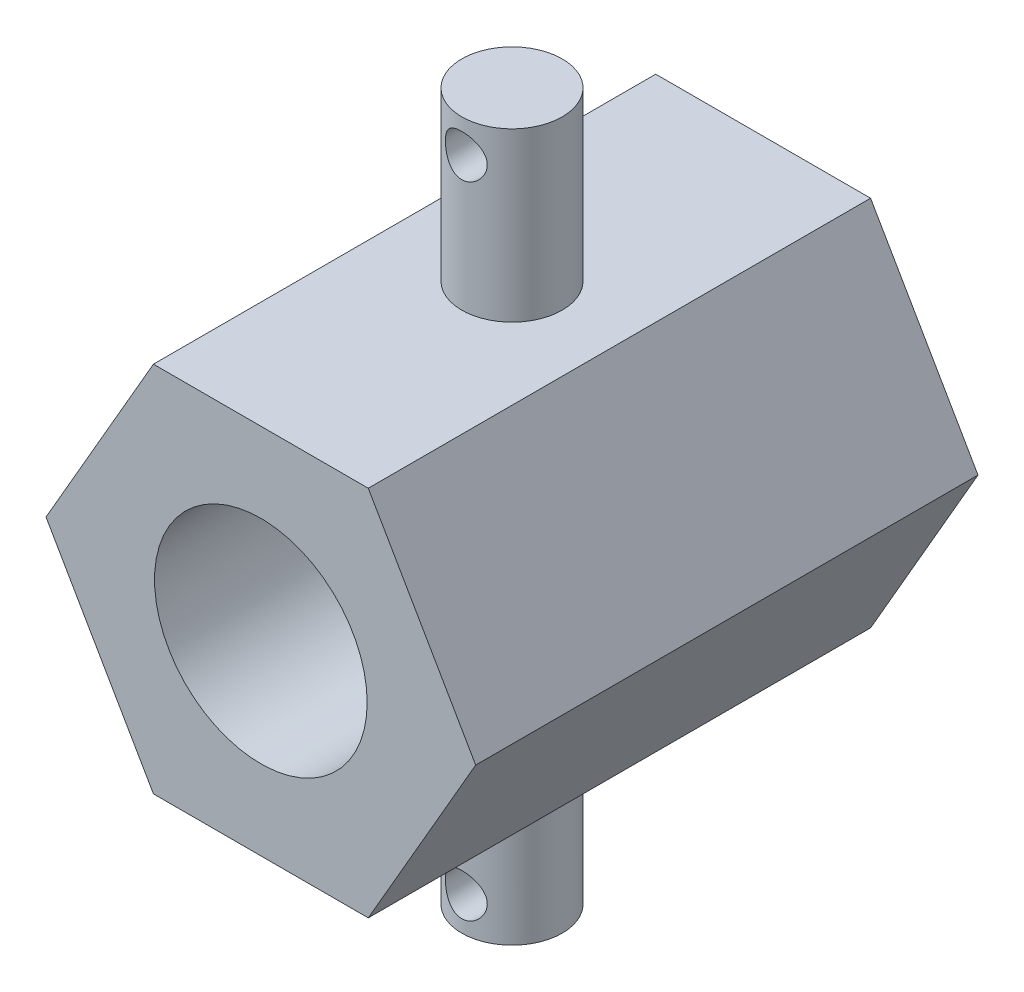
ISO-10303-21;
HEADER;
FILE_DESCRIPTION(('STEP AP214'),'2;1');
FILE_NAME('part.step','',(''),(''),'','','');
FILE_SCHEMA(('AUTOMOTIVE_DESIGN { 1 0 10303 214 1 1 1 1 }'));
ENDSEC;
DATA;
#1=APPLICATION_CONTEXT('core data for automotive mechanical design processes');
#2=APPLICATION_PROTOCOL_DEFINITION('international standard','automotive_design',2000,#1);
#3=PRODUCT_CONTEXT('',#1,'mechanical');
#4=PRODUCT('Part','Part','',(#3));
#5=PRODUCT_RELATED_PRODUCT_CATEGORY('part','',(#4));
#6=PRODUCT_DEFINITION_FORMATION('','',#4);
#7=PRODUCT_DEFINITION_CONTEXT('part definition',#1,'design');
#8=PRODUCT_DEFINITION('design','',#6,#7);
#9=PRODUCT_DEFINITION_SHAPE('','',#8);
#10=(LENGTH_UNIT() NAMED_UNIT(*) SI_UNIT(.MILLI.,.METRE.));
#11=(NAMED_UNIT(*) PLANE_ANGLE_UNIT() SI_UNIT($,.RADIAN.));
#12=(NAMED_UNIT(*) SI_UNIT($,.STERADIAN.) SOLID_ANGLE_UNIT());
#13=UNCERTAINTY_MEASURE_WITH_UNIT(LENGTH_MEASURE(1.E-05),#10,'distance_accuracy_value','');
#14=(GEOMETRIC_REPRESENTATION_CONTEXT(3) GLOBAL_UNCERTAINTY_ASSIGNED_CONTEXT((#13)) GLOBAL_UNIT_ASSIGNED_CONTEXT((#10,
#11,#12)) REPRESENTATION_CONTEXT('',''));
#15=CARTESIAN_POINT('',(0.,0.,0.));
#16=DIRECTION('',(0.,0.,1.));
#17=DIRECTION('',(1.,0.,0.));
#18=AXIS2_PLACEMENT_3D('',#15,#16,#17);
#19=CARTESIAN_POINT('',(0.,-21.1125,15.));
#20=DIRECTION('',(0.,1.,0.));
#21=DIRECTION('',(-1.,0.,0.));
#22=AXIS2_PLACEMENT_3D('',#19,#20,#21);
#23=CYLINDRICAL_SURFACE('',#22,3.);
#24=CARTESIAN_POINT('',(0.,-21.1125,15.));
#25=DIRECTION('',(0.,-1.,0.));
#26=DIRECTION('',(1.,0.,0.));
#27=AXIS2_PLACEMENT_3D('',#24,#25,#26);
#28=CIRCLE('',#27,3.);
#29=CARTESIAN_POINT('',(2.99999999999999,-21.1125,15.));
#30=VERTEX_POINT('',#29);
#31=EDGE_CURVE('E186',#30,#30,#28,.T.);
#32=ORIENTED_EDGE('',*,*,#31,.F.);
#33=EDGE_LOOP('',(#32));
#34=FACE_BOUND('',#33,.T.);
#35=CARTESIAN_POINT('',(0.,-11.1125,15.));
#36=DIRECTION('',(0.,1.,0.));
#37=DIRECTION('',(-1.,0.,0.));
#38=AXIS2_PLACEMENT_3D('',#35,#36,#37);
#39=CIRCLE('',#38,3.);
#40=CARTESIAN_POINT('',(-3.,-11.1125,15.));
#41=VERTEX_POINT('',#40);
#42=EDGE_CURVE('E11',#41,#41,#39,.F.);
#43=ORIENTED_EDGE('',*,*,#42,.T.);
#44=EDGE_LOOP('',(#43));
#45=FACE_BOUND('',#44,.T.);
#46=CARTESIAN_POINT('',(-1.25,-19.1125,12.2728219713411));
#47=CARTESIAN_POINT('',(-1.24999259066568,-19.0458281091031,12.2728148043678));
#48=CARTESIAN_POINT('',(-1.24463203881503,-18.9790473431738,12.270341404656));
#49=CARTESIAN_POINT('',(-1.22339678947785,-18.8474130579429,12.2607616634912));
#50=CARTESIAN_POINT('',(-1.20749354003277,-18.7825652733248,12.2536427417573));
#51=CARTESIAN_POINT('',(-1.16589988419451,-18.6569388703089,12.2357308242523));
#52=CARTESIAN_POINT('',(-1.14024937431428,-18.596144836285,12.2249528243738));
#53=CARTESIAN_POINT('',(-1.08000637754463,-18.4797405504219,12.2009585143421));
#54=CARTESIAN_POINT('',(-1.04541600591531,-18.4241290765669,12.1877427811922));
#55=CARTESIAN_POINT('',(-0.965973882676167,-18.3161742750265,12.1594423738014));
#56=CARTESIAN_POINT('',(-0.920653238184409,-18.2641924412559,12.1442943192085));
#57=CARTESIAN_POINT('',(-0.822021675745551,-18.1682997775024,12.1143570462777));
#58=CARTESIAN_POINT('',(-0.768707691374005,-18.124392059387,12.0995679681921));
#59=CARTESIAN_POINT('',(-0.652763393797348,-18.0440504691207,12.0712446206939));
#60=CARTESIAN_POINT('',(-0.589829293683659,-18.0080233719676,12.0577926002471));
#61=CARTESIAN_POINT('',(-0.458132022362353,-17.9472239794944,12.0344348000657));
#62=CARTESIAN_POINT('',(-0.389371454872123,-17.9224466880358,12.0245274465284));
#63=CARTESIAN_POINT('',(-0.251768498025164,-17.8861605412433,12.0098247895763));
#64=CARTESIAN_POINT('',(-0.183116576196079,-17.874028305098,12.0047902887253));
#65=CARTESIAN_POINT('',(-0.0445791803650048,-17.8613623588401,11.999531713888));
#66=CARTESIAN_POINT('',(0.0253057817645178,-17.860823944117,11.9993056886898));
#67=CARTESIAN_POINT('',(0.159792780112569,-17.8710342809333,12.0035487086694));
#68=CARTESIAN_POINT('',(0.224457488607315,-17.8810981005257,12.0077328535134));
#69=CARTESIAN_POINT('',(0.351082893931458,-17.9110531026382,12.0199348324969));
#70=CARTESIAN_POINT('',(0.413043391054918,-17.9309450096302,12.0279529492542));
#71=CARTESIAN_POINT('',(0.533638118077528,-17.9802280408946,12.0472014758597));
#72=CARTESIAN_POINT('',(0.592207177074908,-18.0097594628708,12.0584790287392));
#73=CARTESIAN_POINT('',(0.703711767281965,-18.0773457567003,12.0831428601019));
#74=CARTESIAN_POINT('',(0.756645297756976,-18.115403640845,12.0965298833374));
#75=CARTESIAN_POINT('',(0.859340911707926,-18.2020824204046,12.1251830122294));
#76=CARTESIAN_POINT('',(0.908616437316242,-18.251258791279,12.1405150564399));
#77=CARTESIAN_POINT('',(0.998431414927669,-18.3572114407066,12.1706213931853));
#78=CARTESIAN_POINT('',(1.03896749582431,-18.4139906382921,12.1853954686863));
#79=CARTESIAN_POINT('',(1.11140189250064,-18.5358950366619,12.2131838764466));
#80=CARTESIAN_POINT('',(1.1429725335554,-18.6012332057433,12.2261244144329));
#81=CARTESIAN_POINT('',(1.19446432058392,-18.7369810449745,12.2479015577899));
#82=CARTESIAN_POINT('',(1.21439379627313,-18.8073870482695,12.2567410966541));
#83=CARTESIAN_POINT('',(1.24080025168121,-18.946396808914,12.2685878748028));
#84=CARTESIAN_POINT('',(1.24806614632866,-19.014821122259,12.2719363080288));
#85=CARTESIAN_POINT('',(1.25125630518999,-19.1519784824115,12.2733971318936));
#86=CARTESIAN_POINT('',(1.24718449318149,-19.2207114141917,12.2715113340068));
#87=CARTESIAN_POINT('',(1.22853477565556,-19.3518983854304,12.2630686865425));
#88=CARTESIAN_POINT('',(1.21464618818049,-19.4144726867868,12.2568186198338));
#89=CARTESIAN_POINT('',(1.17767058564226,-19.5363512964979,12.2407436970255));
#90=CARTESIAN_POINT('',(1.15458142053125,-19.5956548368307,12.2309180053984));
#91=CARTESIAN_POINT('',(1.09877520805187,-19.7121153103565,12.20829202143));
#92=CARTESIAN_POINT('',(1.06569183306198,-19.7690749746103,12.1953833779772));
#93=CARTESIAN_POINT('',(0.991200784385971,-19.876908052499,12.1681999625921));
#94=CARTESIAN_POINT('',(0.949789507875988,-19.9277788167019,12.1539246007942));
#95=CARTESIAN_POINT('',(0.855844455715506,-20.026300134884,12.1242138021547));
#96=CARTESIAN_POINT('',(0.802679661479739,-20.0733513999507,12.1087785329116));
#97=CARTESIAN_POINT('',(0.68885151255354,-20.1579722919793,12.0795663881608));
#98=CARTESIAN_POINT('',(0.628187608803657,-20.1955412240637,12.0657896342299));
#99=CARTESIAN_POINT('',(0.500654680803386,-20.2600898754436,12.0413574841435));
#100=CARTESIAN_POINT('',(0.433770169638508,-20.2870422412895,12.0307101686117));
#101=CARTESIAN_POINT('',(0.295858835154419,-20.3291167923344,12.0138182689663));
#102=CARTESIAN_POINT('',(0.224834504225197,-20.3442460182261,12.0075710648008));
#103=CARTESIAN_POINT('',(0.0860165335064124,-20.3613581255203,12.0004846520249));
#104=CARTESIAN_POINT('',(0.0183440847938988,-20.364185999697,11.9992979546577));
#105=CARTESIAN_POINT('',(-0.116486811714285,-20.3588868587061,12.0015047651905));
#106=CARTESIAN_POINT('',(-0.183645347541156,-20.3507617639871,12.0048974701569));
#107=CARTESIAN_POINT('',(-0.313086482449186,-20.3243939278413,12.0156993401827));
#108=CARTESIAN_POINT('',(-0.37545753784357,-20.3065203195304,12.0229617579077));
#109=CARTESIAN_POINT('',(-0.496292230501332,-20.2615657527909,12.0407050015294));
#110=CARTESIAN_POINT('',(-0.554755122985828,-20.2344830453351,12.0511864387579));
#111=CARTESIAN_POINT('',(-0.669024565478783,-20.1705104707855,12.0749417460134));
#112=CARTESIAN_POINT('',(-0.724591657976684,-20.133232698576,12.0883204081123));
#113=CARTESIAN_POINT('',(-0.828918675638783,-20.0504928171281,12.1162843812577));
#114=CARTESIAN_POINT('',(-0.877676061786044,-20.0050276695932,12.130870139162));
#115=CARTESIAN_POINT('',(-0.970449787231582,-19.9035551741456,12.1608515474086));
#116=CARTESIAN_POINT('',(-1.01391775364847,-19.8470409853789,12.176234771421));
#117=CARTESIAN_POINT('',(-1.09083332306675,-19.7270412593198,12.2050444730981));
#118=CARTESIAN_POINT('',(-1.12427532456755,-19.6635518519419,12.2184698547744));
#119=CARTESIAN_POINT('',(-1.17982766043577,-19.5315561649772,12.2415744226736));
#120=CARTESIAN_POINT('',(-1.20199823632854,-19.4630788412068,12.2512734553013));
#121=CARTESIAN_POINT('',(-1.23423556453801,-19.3229604261493,12.2655919693333));
#122=CARTESIAN_POINT('',(-1.2443429152121,-19.2513307927257,12.2702284839502));
#123=CARTESIAN_POINT('',(-1.2494046492365,-19.1571414757381,12.2725502026731));
#124=CARTESIAN_POINT('',(-1.25000248121118,-19.134826842612,12.2728243713913));
#125=CARTESIAN_POINT('',(-1.25,-19.1125,12.2728219713411));
#126=B_SPLINE_CURVE_WITH_KNOTS('',3,(#46,#47,#48,#49,#50,#51,#52,#53,#54,#55,#56,#57,#58,#59,
#60,#61,#62,#63,#64,#65,#66,#67,#68,#69,#70,#71,#72,#73,#74,#75,#76,#77,#78,#79,#80,#81,#82,#83,
#84,#85,#86,#87,#88,#89,#90,#91,#92,#93,#94,#95,#96,#97,#98,#99,#100,#101,#102,#103,#104,#105,
#106,#107,#108,#109,#110,#111,#112,#113,#114,#115,#116,#117,#118,#119,#120,#121,#122,#123,#124,
#125),.UNSPECIFIED.,.T.,.F.,(4,2,2,2,2,2,2,2,2,2,2,2,2,2,2,2,2,2,2,2,2,2,2,2,2,2,2,2,2,2,2,2,2,
2,2,2,2,2,2,4),(0.,0.199951711985515,0.400447161842178,0.600130652152121,0.799766938550102,
1.01066841430654,1.22165100459911,1.44178476577924,1.66182066774891,1.87040605977952,
2.07890680917931,2.27471840245093,2.47054443201884,2.66935814640066,2.86824221022484,
3.08114531844485,3.29413040441367,3.51411545666722,3.7339429074557,3.93950778306308,
4.14500152518449,4.33733901066192,4.5297214691353,4.7302512681817,4.93086800795466,
5.14781662735514,5.36478114041867,5.58230105955595,5.79969134643008,6.00188635094054,
6.20404590801915,6.39903415036489,6.59405944632174,6.79789862829038,7.00181361048906,
7.21960426908078,7.4375163813919,7.65425125796866,7.87025464546164,7.93721375436707),.UNSPECIFIED.);
#127=CARTESIAN_POINT('',(-1.25,-19.1125,12.2728219713411));
#128=VERTEX_POINT('',#127);
#129=EDGE_CURVE('E145',#128,#128,#126,.T.);
#130=ORIENTED_EDGE('',*,*,#129,.F.);
#131=EDGE_LOOP('',(#130));
#132=FACE_BOUND('',#131,.T.);
#133=CARTESIAN_POINT('',(-1.25,-19.1125,17.7271780286589));
#134=CARTESIAN_POINT('',(-1.24999259066568,-19.1791718908968,17.7271851956322));
#135=CARTESIAN_POINT('',(-1.24463203881503,-19.2459526568262,17.729658595344));
#136=CARTESIAN_POINT('',(-1.22339678947785,-19.3775869420571,17.7392383365088));
#137=CARTESIAN_POINT('',(-1.20749354003277,-19.4424347266752,17.7463572582427));
#138=CARTESIAN_POINT('',(-1.16589988419451,-19.5680611296911,17.7642691757477));
#139=CARTESIAN_POINT('',(-1.14024937431428,-19.628855163715,17.7750471756262));
#140=CARTESIAN_POINT('',(-1.08000637754463,-19.7452594495781,17.7990414856579));
#141=CARTESIAN_POINT('',(-1.04541600591531,-19.8008709234331,17.8122572188078));
#142=CARTESIAN_POINT('',(-0.965973882676167,-19.9088257249735,17.8405576261986));
#143=CARTESIAN_POINT('',(-0.92065323818441,-19.9608075587441,17.8557056807915));
#144=CARTESIAN_POINT('',(-0.82202167574555,-20.0567002224976,17.8856429537223));
#145=CARTESIAN_POINT('',(-0.768707691374004,-20.100607940613,17.9004320318079));
#146=CARTESIAN_POINT('',(-0.652763393797348,-20.1809495308793,17.9287553793061));
#147=CARTESIAN_POINT('',(-0.589829293683659,-20.2169766280323,17.9422073997529));
#148=CARTESIAN_POINT('',(-0.458132022362353,-20.2777760205056,17.9655651999343));
#149=CARTESIAN_POINT('',(-0.389371454872123,-20.3025533119642,17.9754725534716));
#150=CARTESIAN_POINT('',(-0.251768498025164,-20.3388394587567,17.9901752104237));
#151=CARTESIAN_POINT('',(-0.183116576196079,-20.350971694902,17.9952097112747));
#152=CARTESIAN_POINT('',(-0.0445791803650051,-20.3636376411599,18.000468286112));
#153=CARTESIAN_POINT('',(0.0253057817645174,-20.364176055883,18.0006943113101));
#154=CARTESIAN_POINT('',(0.159792780112569,-20.3539657190667,17.9964512913306));
#155=CARTESIAN_POINT('',(0.224457488607315,-20.3439018994743,17.9922671464866));
#156=CARTESIAN_POINT('',(0.351082893931458,-20.3139468973618,17.9800651675031));
#157=CARTESIAN_POINT('',(0.413043391054918,-20.2940549903698,17.9720470507458));
#158=CARTESIAN_POINT('',(0.533638118077527,-20.2447719591054,17.9527985241403));
#159=CARTESIAN_POINT('',(0.592207177074908,-20.2152405371292,17.9415209712609));
#160=CARTESIAN_POINT('',(0.703711767281965,-20.1476542432997,17.916857139898));
#161=CARTESIAN_POINT('',(0.756645297756975,-20.109596359155,17.9034701166626));
#162=CARTESIAN_POINT('',(0.859340911707925,-20.0229175795954,17.8748169877706));
#163=CARTESIAN_POINT('',(0.908616437316243,-19.973741208721,17.8594849435601));
#164=CARTESIAN_POINT('',(0.998431414927671,-19.8677885592934,17.8293786068147));
#165=CARTESIAN_POINT('',(1.03896749582432,-19.8110093617079,17.8146045313137));
#166=CARTESIAN_POINT('',(1.11140189250064,-19.6891049633381,17.7868161235534));
#167=CARTESIAN_POINT('',(1.14297253355541,-19.6237667942567,17.7738755855671));
#168=CARTESIAN_POINT('',(1.19446432058392,-19.4880189550255,17.7520984422101));
#169=CARTESIAN_POINT('',(1.21439379627313,-19.4176129517304,17.7432589033459));
#170=CARTESIAN_POINT('',(1.24080025168121,-19.278603191086,17.7314121251972));
#171=CARTESIAN_POINT('',(1.24806614632866,-19.2101788777409,17.7280636919712));
#172=CARTESIAN_POINT('',(1.25125630518999,-19.0730215175885,17.7266028681064));
#173=CARTESIAN_POINT('',(1.24718449318149,-19.0042885858083,17.7284886659932));
#174=CARTESIAN_POINT('',(1.22853477565556,-18.8731016145696,17.7369313134575));
#175=CARTESIAN_POINT('',(1.21464618818048,-18.8105273132132,17.7431813801662));
#176=CARTESIAN_POINT('',(1.17767058564225,-18.6886487035021,17.7592563029745));
#177=CARTESIAN_POINT('',(1.15458142053125,-18.6293451631693,17.7690819946016));
#178=CARTESIAN_POINT('',(1.09877520805187,-18.5128846896435,17.79170797857));
#179=CARTESIAN_POINT('',(1.06569183306198,-18.4559250253897,17.8046166220228));
#180=CARTESIAN_POINT('',(0.991200784385971,-18.348091947501,17.8318000374079));
#181=CARTESIAN_POINT('',(0.949789507875988,-18.2972211832981,17.8460753992058));
#182=CARTESIAN_POINT('',(0.855844455715506,-18.198699865116,17.8757861978453));
#183=CARTESIAN_POINT('',(0.802679661479739,-18.1516486000493,17.8912214670884));
#184=CARTESIAN_POINT('',(0.68885151255354,-18.0670277080207,17.9204336118392));
#185=CARTESIAN_POINT('',(0.628187608803657,-18.0294587759363,17.9342103657701));
#186=CARTESIAN_POINT('',(0.500654680803385,-17.9649101245564,17.9586425158565));
#187=CARTESIAN_POINT('',(0.433770169638508,-17.9379577587105,17.9692898313883));
#188=CARTESIAN_POINT('',(0.295858835154419,-17.8958832076656,17.9861817310337));
#189=CARTESIAN_POINT('',(0.224834504225197,-17.8807539817739,17.9924289351992));
#190=CARTESIAN_POINT('',(0.0860165335064122,-17.8636418744797,17.9995153479751));
#191=CARTESIAN_POINT('',(0.0183440847938987,-17.860814000303,18.0007020453423));
#192=CARTESIAN_POINT('',(-0.116486811714285,-17.8661131412939,17.9984952348095));
#193=CARTESIAN_POINT('',(-0.183645347541156,-17.8742382360129,17.9951025298431));
#194=CARTESIAN_POINT('',(-0.313086482449186,-17.9006060721587,17.9843006598173));
#195=CARTESIAN_POINT('',(-0.37545753784357,-17.9184796804695,17.9770382420923));
#196=CARTESIAN_POINT('',(-0.496292230501332,-17.9634342472091,17.9592949984706));
#197=CARTESIAN_POINT('',(-0.554755122985828,-17.9905169546649,17.9488135612421));
#198=CARTESIAN_POINT('',(-0.669024565478784,-18.0544895292145,17.9250582539866));
#199=CARTESIAN_POINT('',(-0.724591657976686,-18.091767301424,17.9116795918877));
#200=CARTESIAN_POINT('',(-0.828918675638785,-18.1745071828719,17.8837156187423));
#201=CARTESIAN_POINT('',(-0.877676061786045,-18.2199723304067,17.869129860838));
#202=CARTESIAN_POINT('',(-0.970449787231582,-18.3214448258544,17.8391484525914));
#203=CARTESIAN_POINT('',(-1.01391775364847,-18.3779590146211,17.823765228579));
#204=CARTESIAN_POINT('',(-1.09083332306675,-18.4979587406802,17.7949555269019));
#205=CARTESIAN_POINT('',(-1.12427532456755,-18.5614481480581,17.7815301452256));
#206=CARTESIAN_POINT('',(-1.17982766043577,-18.6934438350227,17.7584255773264));
#207=CARTESIAN_POINT('',(-1.20199823632854,-18.7619211587932,17.7487265446987));
#208=CARTESIAN_POINT('',(-1.23423556453801,-18.9020395738507,17.7344080306667));
#209=CARTESIAN_POINT('',(-1.2443429152121,-18.9736692072743,17.7297715160498));
#210=CARTESIAN_POINT('',(-1.2494046492365,-19.0678585242619,17.7274497973269));
#211=CARTESIAN_POINT('',(-1.25000248121118,-19.090173157388,17.7271756286087));
#212=CARTESIAN_POINT('',(-1.25,-19.1125,17.7271780286589));
#213=B_SPLINE_CURVE_WITH_KNOTS('',3,(#133,#134,#135,#136,#137,#138,#139,#140,#141,#142,#143,
#144,#145,#146,#147,#148,#149,#150,#151,#152,#153,#154,#155,#156,#157,#158,#159,#160,#161,#162,
#163,#164,#165,#166,#167,#168,#169,#170,#171,#172,#173,#174,#175,#176,#177,#178,#179,#180,#181,
#182,#183,#184,#185,#186,#187,#188,#189,#190,#191,#192,#193,#194,#195,#196,#197,#198,#199,#200,
#201,#202,#203,#204,#205,#206,#207,#208,#209,#210,#211,#212),.UNSPECIFIED.,.T.,.F.,(4,2,2,2,2,2,
2,2,2,2,2,2,2,2,2,2,2,2,2,2,2,2,2,2,2,2,2,2,2,2,2,2,2,2,2,2,2,2,2,4),(0.,0.199951711985515,
0.400447161842177,0.600130652152113,0.799766938550101,1.01066841430654,1.22165100459911,
1.44178476577924,1.66182066774891,1.87040605977952,2.07890680917931,2.27471840245093,
2.47054443201884,2.66935814640066,2.86824221022484,3.08114531844485,3.29413040441367,
3.51411545666723,3.7339429074557,3.93950778306308,4.14500152518449,4.33733901066193,
4.52972146913531,4.7302512681817,4.93086800795466,5.14781662735515,5.36478114041867,
5.58230105955595,5.79969134643008,6.00188635094054,6.20404590801915,6.39903415036489,
6.59405944632174,6.79789862829038,7.00181361048906,7.21960426908078,7.4375163813919,
7.65425125796866,7.87025464546164,7.93721375436707),.UNSPECIFIED.);
#214=CARTESIAN_POINT('',(-1.25,-19.1125,17.7271780286589));
#215=VERTEX_POINT('',#214);
#216=EDGE_CURVE('E152',#215,#215,#213,.T.);
#217=ORIENTED_EDGE('',*,*,#216,.F.);
#218=EDGE_LOOP('',(#217));
#219=FACE_BOUND('',#218,.T.);
#220=ADVANCED_FACE('F33',(#34,#45,#132,#219),#23,.T.);
#221=CARTESIAN_POINT('',(0.,0.,30.));
#222=DIRECTION('',(0.,0.,1.));
#223=DIRECTION('',(1.,0.,0.));
#224=AXIS2_PLACEMENT_3D('',#221,#222,#223);
#225=PLANE('',#224);
#226=DIRECTION('',(1.,0.,0.));
#227=VECTOR('',#226,1.);
#228=CARTESIAN_POINT('',(-6.41580486636972,-11.1125,30.));
#229=LINE('',#228,#227);
#230=CARTESIAN_POINT('',(-6.41580486636972,-11.1125,30.));
#231=VERTEX_POINT('',#230);
#232=CARTESIAN_POINT('',(6.41580486636971,-11.1125,30.));
#233=VERTEX_POINT('',#232);
#234=EDGE_CURVE('E137',#231,#233,#229,.T.);
#235=ORIENTED_EDGE('',*,*,#234,.T.);
#236=DIRECTION('',(0.5,0.866025403784438,0.));
#237=VECTOR('',#236,1.);
#238=CARTESIAN_POINT('',(6.41580486636971,-11.1125,30.));
#239=LINE('',#238,#237);
#240=CARTESIAN_POINT('',(12.8316097327394,0.,30.));
#241=VERTEX_POINT('',#240);
#242=EDGE_CURVE('E94',#233,#241,#239,.T.);
#243=ORIENTED_EDGE('',*,*,#242,.T.);
#244=DIRECTION('',(-0.5,0.866025403784439,0.));
#245=VECTOR('',#244,1.);
#246=CARTESIAN_POINT('',(12.8316097327394,0.,30.));
#247=LINE('',#246,#245);
#248=CARTESIAN_POINT('',(6.41580486636971,11.1125,30.));
#249=VERTEX_POINT('',#248);
#250=EDGE_CURVE('E108',#241,#249,#247,.T.);
#251=ORIENTED_EDGE('',*,*,#250,.T.);
#252=DIRECTION('',(-1.,0.,0.));
#253=VECTOR('',#252,1.);
#254=CARTESIAN_POINT('',(6.41580486636971,11.1125,30.));
#255=LINE('',#254,#253);
#256=CARTESIAN_POINT('',(-6.41580486636972,11.1125,30.));
#257=VERTEX_POINT('',#256);
#258=EDGE_CURVE('E101',#249,#257,#255,.T.);
#259=ORIENTED_EDGE('',*,*,#258,.T.);
#260=DIRECTION('',(-0.5,-0.866025403784438,0.));
#261=VECTOR('',#260,1.);
#262=CARTESIAN_POINT('',(-6.41580486636972,11.1125,30.));
#263=LINE('',#262,#261);
#264=CARTESIAN_POINT('',(-12.8316097327394,0.,30.));
#265=VERTEX_POINT('',#264);
#266=EDGE_CURVE('E106',#257,#265,#263,.T.);
#267=ORIENTED_EDGE('',*,*,#266,.T.);
#268=DIRECTION('',(0.5,-0.866025403784439,0.));
#269=VECTOR('',#268,1.);
#270=CARTESIAN_POINT('',(-12.8316097327394,0.,30.));
#271=LINE('',#270,#269);
#272=EDGE_CURVE('E56',#265,#231,#271,.T.);
#273=ORIENTED_EDGE('',*,*,#272,.T.);
#274=EDGE_LOOP('',(#235,#243,#251,#259,#267,#273));
#275=FACE_BOUND('',#274,.T.);
#276=CARTESIAN_POINT('',(0.,0.,30.));
#277=DIRECTION('',(0.,0.,1.));
#278=DIRECTION('',(1.,0.,0.));
#279=AXIS2_PLACEMENT_3D('',#276,#277,#278);
#280=CIRCLE('',#279,6.35);
#281=CARTESIAN_POINT('',(6.35,0.,30.));
#282=VERTEX_POINT('',#281);
#283=EDGE_CURVE('E130',#282,#282,#280,.T.);
#284=ORIENTED_EDGE('',*,*,#283,.F.);
#285=EDGE_LOOP('',(#284));
#286=FACE_BOUND('',#285,.T.);
#287=ADVANCED_FACE('F103',(#275,#286),#225,.T.);
#288=CARTESIAN_POINT('',(0.,0.,0.));
#289=DIRECTION('',(0.,0.,1.));
#290=DIRECTION('',(1.,0.,0.));
#291=AXIS2_PLACEMENT_3D('',#288,#289,#290);
#292=PLANE('',#291);
#293=DIRECTION('',(1.,0.,0.));
#294=VECTOR('',#293,1.);
#295=CARTESIAN_POINT('',(-6.41580486636972,-11.1125,0.));
#296=LINE('',#295,#294);
#297=CARTESIAN_POINT('',(-6.41580486636972,-11.1125,0.));
#298=VERTEX_POINT('',#297);
#299=CARTESIAN_POINT('',(6.41580486636971,-11.1125,0.));
#300=VERTEX_POINT('',#299);
#301=EDGE_CURVE('E126',#298,#300,#296,.T.);
#302=ORIENTED_EDGE('',*,*,#301,.F.);
#303=DIRECTION('',(0.5,-0.866025403784439,0.));
#304=VECTOR('',#303,1.);
#305=CARTESIAN_POINT('',(-12.8316097327394,0.,0.));
#306=LINE('',#305,#304);
#307=CARTESIAN_POINT('',(-12.8316097327394,0.,0.));
#308=VERTEX_POINT('',#307);
#309=EDGE_CURVE('E85',#308,#298,#306,.T.);
#310=ORIENTED_EDGE('',*,*,#309,.F.);
#311=DIRECTION('',(-0.5,-0.866025403784438,0.));
#312=VECTOR('',#311,1.);
#313=CARTESIAN_POINT('',(-6.41580486636972,11.1125,0.));
#314=LINE('',#313,#312);
#315=CARTESIAN_POINT('',(-6.41580486636972,11.1125,0.));
#316=VERTEX_POINT('',#315);
#317=EDGE_CURVE('E79',#316,#308,#314,.T.);
#318=ORIENTED_EDGE('',*,*,#317,.F.);
#319=DIRECTION('',(-1.,0.,0.));
#320=VECTOR('',#319,1.);
#321=CARTESIAN_POINT('',(6.41580486636971,11.1125,0.));
#322=LINE('',#321,#320);
#323=CARTESIAN_POINT('',(6.41580486636971,11.1125,0.));
#324=VERTEX_POINT('',#323);
#325=EDGE_CURVE('E116',#324,#316,#322,.T.);
#326=ORIENTED_EDGE('',*,*,#325,.F.);
#327=DIRECTION('',(-0.5,0.866025403784439,0.));
#328=VECTOR('',#327,1.);
#329=CARTESIAN_POINT('',(12.8316097327394,0.,0.));
#330=LINE('',#329,#328);
#331=CARTESIAN_POINT('',(12.8316097327394,0.,0.));
#332=VERTEX_POINT('',#331);
#333=EDGE_CURVE('E132',#332,#324,#330,.T.);
#334=ORIENTED_EDGE('',*,*,#333,.F.);
#335=DIRECTION('',(0.5,0.866025403784438,0.));
#336=VECTOR('',#335,1.);
#337=CARTESIAN_POINT('',(6.41580486636971,-11.1125,0.));
#338=LINE('',#337,#336);
#339=EDGE_CURVE('E129',#300,#332,#338,.T.);
#340=ORIENTED_EDGE('',*,*,#339,.F.);
#341=EDGE_LOOP('',(#302,#310,#318,#326,#334,#340));
#342=FACE_BOUND('',#341,.T.);
#343=CARTESIAN_POINT('',(0.,0.,0.));
#344=DIRECTION('',(0.,0.,1.));
#345=DIRECTION('',(1.,0.,0.));
#346=AXIS2_PLACEMENT_3D('',#343,#344,#345);
#347=CIRCLE('',#346,6.35);
#348=CARTESIAN_POINT('',(6.35,0.,0.));
#349=VERTEX_POINT('',#348);
#350=EDGE_CURVE('E194',#349,#349,#347,.T.);
#351=ORIENTED_EDGE('',*,*,#350,.T.);
#352=EDGE_LOOP('',(#351));
#353=FACE_BOUND('',#352,.T.);
#354=ADVANCED_FACE('F182',(#342,#353),#292,.F.);
#355=CARTESIAN_POINT('',(-6.41580486636972,-11.1125,30.));
#356=DIRECTION('',(0.,1.,0.));
#357=DIRECTION('',(-1.,0.,0.));
#358=AXIS2_PLACEMENT_3D('',#355,#356,#357);
#359=PLANE('',#358);
#360=ORIENTED_EDGE('',*,*,#42,.F.);
#361=EDGE_LOOP('',(#360));
#362=FACE_BOUND('',#361,.T.);
#363=ORIENTED_EDGE('',*,*,#301,.T.);
#364=DIRECTION('',(0.,0.,-1.));
#365=VECTOR('',#364,1.);
#366=CARTESIAN_POINT('',(6.41580486636971,-11.1125,30.));
#367=LINE('',#366,#365);
#368=EDGE_CURVE('E47',#233,#300,#367,.T.);
#369=ORIENTED_EDGE('',*,*,#368,.F.);
#370=ORIENTED_EDGE('',*,*,#234,.F.);
#371=DIRECTION('',(0.,0.,-1.));
#372=VECTOR('',#371,1.);
#373=CARTESIAN_POINT('',(-6.41580486636972,-11.1125,30.));
#374=LINE('',#373,#372);
#375=EDGE_CURVE('E122',#231,#298,#374,.T.);
#376=ORIENTED_EDGE('',*,*,#375,.T.);
#377=EDGE_LOOP('',(#363,#369,#370,#376));
#378=FACE_BOUND('',#377,.T.);
#379=ADVANCED_FACE('F35',(#362,#378),#359,.F.);
#380=CARTESIAN_POINT('',(6.41580486636971,-11.1125,30.));
#381=DIRECTION('',(-0.866025403784438,0.5,0.));
#382=DIRECTION('',(-0.5,-0.866025403784439,0.));
#383=AXIS2_PLACEMENT_3D('',#380,#381,#382);
#384=PLANE('',#383);
#385=ORIENTED_EDGE('',*,*,#339,.T.);
#386=DIRECTION('',(0.,0.,-1.));
#387=VECTOR('',#386,1.);
#388=CARTESIAN_POINT('',(12.8316097327394,0.,30.));
#389=LINE('',#388,#387);
#390=EDGE_CURVE('E141',#241,#332,#389,.T.);
#391=ORIENTED_EDGE('',*,*,#390,.F.);
#392=ORIENTED_EDGE('',*,*,#242,.F.);
#393=ORIENTED_EDGE('',*,*,#368,.T.);
#394=EDGE_LOOP('',(#385,#391,#392,#393));
#395=FACE_BOUND('',#394,.T.);
#396=ADVANCED_FACE('F207',(#395),#384,.F.);
#397=CARTESIAN_POINT('',(12.8316097327394,0.,30.));
#398=DIRECTION('',(-0.866025403784439,-0.5,0.));
#399=DIRECTION('',(0.5,-0.866025403784439,0.));
#400=AXIS2_PLACEMENT_3D('',#397,#398,#399);
#401=PLANE('',#400);
#402=ORIENTED_EDGE('',*,*,#333,.T.);
#403=DIRECTION('',(0.,0.,-1.));
#404=VECTOR('',#403,1.);
#405=CARTESIAN_POINT('',(6.41580486636971,11.1125,30.));
#406=LINE('',#405,#404);
#407=EDGE_CURVE('E117',#249,#324,#406,.T.);
#408=ORIENTED_EDGE('',*,*,#407,.F.);
#409=ORIENTED_EDGE('',*,*,#250,.F.);
#410=ORIENTED_EDGE('',*,*,#390,.T.);
#411=EDGE_LOOP('',(#402,#408,#409,#410));
#412=FACE_BOUND('',#411,.T.);
#413=ADVANCED_FACE('F210',(#412),#401,.F.);
#414=CARTESIAN_POINT('',(6.41580486636971,11.1125,30.));
#415=DIRECTION('',(0.,-1.,0.));
#416=DIRECTION('',(0.,0.,-1.));
#417=AXIS2_PLACEMENT_3D('',#414,#415,#416);
#418=PLANE('',#417);
#419=CARTESIAN_POINT('',(0.,11.1125,15.));
#420=DIRECTION('',(0.,-1.,0.));
#421=DIRECTION('',(1.,0.,0.));
#422=AXIS2_PLACEMENT_3D('',#419,#420,#421);
#423=CIRCLE('',#422,3.);
#424=CARTESIAN_POINT('',(3.,11.1125,15.));
#425=VERTEX_POINT('',#424);
#426=EDGE_CURVE('E200',#425,#425,#423,.T.);
#427=ORIENTED_EDGE('',*,*,#426,.T.);
#428=EDGE_LOOP('',(#427));
#429=FACE_BOUND('',#428,.T.);
#430=ORIENTED_EDGE('',*,*,#325,.T.);
#431=DIRECTION('',(0.,0.,-1.));
#432=VECTOR('',#431,1.);
#433=CARTESIAN_POINT('',(-6.41580486636972,11.1125,30.));
#434=LINE('',#433,#432);
#435=EDGE_CURVE('E113',#257,#316,#434,.T.);
#436=ORIENTED_EDGE('',*,*,#435,.F.);
#437=ORIENTED_EDGE('',*,*,#258,.F.);
#438=ORIENTED_EDGE('',*,*,#407,.T.);
#439=EDGE_LOOP('',(#430,#436,#437,#438));
#440=FACE_BOUND('',#439,.T.);
#441=ADVANCED_FACE('F114',(#429,#440),#418,.F.);
#442=CARTESIAN_POINT('',(-6.41580486636972,11.1125,30.));
#443=DIRECTION('',(0.866025403784438,-0.5,0.));
#444=DIRECTION('',(0.5,0.866025403784439,0.));
#445=AXIS2_PLACEMENT_3D('',#442,#443,#444);
#446=PLANE('',#445);
#447=ORIENTED_EDGE('',*,*,#317,.T.);
#448=DIRECTION('',(0.,0.,-1.));
#449=VECTOR('',#448,1.);
#450=CARTESIAN_POINT('',(-12.8316097327394,0.,30.));
#451=LINE('',#450,#449);
#452=EDGE_CURVE('E118',#265,#308,#451,.T.);
#453=ORIENTED_EDGE('',*,*,#452,.F.);
#454=ORIENTED_EDGE('',*,*,#266,.F.);
#455=ORIENTED_EDGE('',*,*,#435,.T.);
#456=EDGE_LOOP('',(#447,#453,#454,#455));
#457=FACE_BOUND('',#456,.T.);
#458=ADVANCED_FACE('F120',(#457),#446,.F.);
#459=CARTESIAN_POINT('',(-12.8316097327394,0.,30.));
#460=DIRECTION('',(0.866025403784439,0.5,0.));
#461=DIRECTION('',(-0.5,0.866025403784439,0.));
#462=AXIS2_PLACEMENT_3D('',#459,#460,#461);
#463=PLANE('',#462);
#464=ORIENTED_EDGE('',*,*,#309,.T.);
#465=ORIENTED_EDGE('',*,*,#375,.F.);
#466=ORIENTED_EDGE('',*,*,#272,.F.);
#467=ORIENTED_EDGE('',*,*,#452,.T.);
#468=EDGE_LOOP('',(#464,#465,#466,#467));
#469=FACE_BOUND('',#468,.T.);
#470=ADVANCED_FACE('F175',(#469),#463,.F.);
#471=CARTESIAN_POINT('',(0.,0.,30.));
#472=DIRECTION('',(0.,0.,-1.));
#473=DIRECTION('',(-1.,0.,0.));
#474=AXIS2_PLACEMENT_3D('',#471,#472,#473);
#475=CYLINDRICAL_SURFACE('',#474,6.35);
#476=ORIENTED_EDGE('',*,*,#283,.T.);
#477=EDGE_LOOP('',(#476));
#478=FACE_BOUND('',#477,.T.);
#479=ORIENTED_EDGE('',*,*,#350,.F.);
#480=EDGE_LOOP('',(#479));
#481=FACE_BOUND('',#480,.T.);
#482=ADVANCED_FACE('F169',(#478,#481),#475,.F.);
#483=CARTESIAN_POINT('',(0.,-21.1125,15.));
#484=DIRECTION('',(0.,-1.,0.));
#485=DIRECTION('',(1.,0.,0.));
#486=AXIS2_PLACEMENT_3D('',#483,#484,#485);
#487=PLANE('',#486);
#488=ORIENTED_EDGE('',*,*,#31,.T.);
#489=EDGE_LOOP('',(#488));
#490=FACE_BOUND('',#489,.T.);
#491=ADVANCED_FACE('F163',(#490),#487,.T.);
#492=CARTESIAN_POINT('',(0.,-19.1125,30.));
#493=DIRECTION('',(0.,0.,-1.));
#494=DIRECTION('',(-1.,0.,0.));
#495=AXIS2_PLACEMENT_3D('',#492,#493,#494);
#496=CYLINDRICAL_SURFACE('',#495,1.25);
#497=ORIENTED_EDGE('',*,*,#129,.T.);
#498=EDGE_LOOP('',(#497));
#499=FACE_BOUND('',#498,.T.);
#500=ORIENTED_EDGE('',*,*,#216,.T.);
#501=EDGE_LOOP('',(#500));
#502=FACE_BOUND('',#501,.T.);
#503=ADVANCED_FACE('F159',(#499,#502),#496,.F.);
#504=CARTESIAN_POINT('',(0.,21.1125,15.));
#505=DIRECTION('',(0.,-1.,0.));
#506=DIRECTION('',(1.,0.,0.));
#507=AXIS2_PLACEMENT_3D('',#504,#505,#506);
#508=CYLINDRICAL_SURFACE('',#507,3.);
#509=CARTESIAN_POINT('',(-1.25,19.1125,17.7271780286589));
#510=CARTESIAN_POINT('',(-1.24999259066568,19.0458281091031,17.7271851956322));
#511=CARTESIAN_POINT('',(-1.24463203881503,18.9790473431738,17.729658595344));
#512=CARTESIAN_POINT('',(-1.22339678947785,18.8474130579429,17.7392383365088));
#513=CARTESIAN_POINT('',(-1.20749354003277,18.7825652733248,17.7463572582427));
#514=CARTESIAN_POINT('',(-1.16589988419451,18.6569388703089,17.7642691757477));
#515=CARTESIAN_POINT('',(-1.14024937431428,18.596144836285,17.7750471756262));
#516=CARTESIAN_POINT('',(-1.08000637754463,18.4797405504219,17.7990414856579));
#517=CARTESIAN_POINT('',(-1.04541600591531,18.4241290765669,17.8122572188078));
#518=CARTESIAN_POINT('',(-0.965973882676167,18.3161742750265,17.8405576261986));
#519=CARTESIAN_POINT('',(-0.92065323818441,18.2641924412559,17.8557056807915));
#520=CARTESIAN_POINT('',(-0.822021675745551,18.1682997775024,17.8856429537223));
#521=CARTESIAN_POINT('',(-0.768707691374004,18.124392059387,17.9004320318079));
#522=CARTESIAN_POINT('',(-0.652763393797347,18.0440504691207,17.9287553793061));
#523=CARTESIAN_POINT('',(-0.589829293683658,18.0080233719676,17.9422073997529));
#524=CARTESIAN_POINT('',(-0.458132022362352,17.9472239794944,17.9655651999343));
#525=CARTESIAN_POINT('',(-0.389371454872123,17.9224466880358,17.9754725534716));
#526=CARTESIAN_POINT('',(-0.251768498025164,17.8861605412433,17.9901752104237));
#527=CARTESIAN_POINT('',(-0.183116576196079,17.8740283050979,17.9952097112747));
#528=CARTESIAN_POINT('',(-0.0445791803650044,17.8613623588401,18.000468286112));
#529=CARTESIAN_POINT('',(0.025305781764518,17.860823944117,18.0006943113101));
#530=CARTESIAN_POINT('',(0.159792780112569,17.8710342809333,17.9964512913306));
#531=CARTESIAN_POINT('',(0.224457488607315,17.8810981005257,17.9922671464866));
#532=CARTESIAN_POINT('',(0.351082893931458,17.9110531026382,17.9800651675031));
#533=CARTESIAN_POINT('',(0.413043391054918,17.9309450096302,17.9720470507458));
#534=CARTESIAN_POINT('',(0.533638118077527,17.9802280408946,17.9527985241403));
#535=CARTESIAN_POINT('',(0.592207177074908,18.0097594628708,17.9415209712609));
#536=CARTESIAN_POINT('',(0.703711767281965,18.0773457567003,17.916857139898));
#537=CARTESIAN_POINT('',(0.756645297756976,18.115403640845,17.9034701166626));
#538=CARTESIAN_POINT('',(0.859340911707925,18.2020824204046,17.8748169877706));
#539=CARTESIAN_POINT('',(0.908616437316242,18.251258791279,17.8594849435601));
#540=CARTESIAN_POINT('',(0.998431414927669,18.3572114407066,17.8293786068147));
#541=CARTESIAN_POINT('',(1.03896749582432,18.4139906382921,17.8146045313137));
#542=CARTESIAN_POINT('',(1.11140189250064,18.5358950366619,17.7868161235534));
#543=CARTESIAN_POINT('',(1.1429725335554,18.6012332057433,17.7738755855671));
#544=CARTESIAN_POINT('',(1.19446432058392,18.7369810449745,17.7520984422101));
#545=CARTESIAN_POINT('',(1.21439379627313,18.8073870482695,17.7432589033459));
#546=CARTESIAN_POINT('',(1.24080025168121,18.946396808914,17.7314121251972));
#547=CARTESIAN_POINT('',(1.24806614632866,19.014821122259,17.7280636919712));
#548=CARTESIAN_POINT('',(1.25125630518999,19.1519784824115,17.7266028681064));
#549=CARTESIAN_POINT('',(1.24718449318149,19.2207114141917,17.7284886659932));
#550=CARTESIAN_POINT('',(1.22853477565556,19.3518983854304,17.7369313134575));
#551=CARTESIAN_POINT('',(1.21464618818049,19.4144726867868,17.7431813801662));
#552=CARTESIAN_POINT('',(1.17767058564226,19.5363512964979,17.7592563029745));
#553=CARTESIAN_POINT('',(1.15458142053125,19.5956548368307,17.7690819946016));
#554=CARTESIAN_POINT('',(1.09877520805187,19.7121153103565,17.79170797857));
#555=CARTESIAN_POINT('',(1.06569183306198,19.7690749746103,17.8046166220228));
#556=CARTESIAN_POINT('',(0.991200784385971,19.876908052499,17.8318000374079));
#557=CARTESIAN_POINT('',(0.949789507875988,19.9277788167019,17.8460753992058));
#558=CARTESIAN_POINT('',(0.855844455715506,20.026300134884,17.8757861978453));
#559=CARTESIAN_POINT('',(0.802679661479739,20.0733513999507,17.8912214670884));
#560=CARTESIAN_POINT('',(0.68885151255354,20.1579722919793,17.9204336118392));
#561=CARTESIAN_POINT('',(0.628187608803657,20.1955412240637,17.9342103657701));
#562=CARTESIAN_POINT('',(0.500654680803385,20.2600898754436,17.9586425158565));
#563=CARTESIAN_POINT('',(0.433770169638508,20.2870422412895,17.9692898313883));
#564=CARTESIAN_POINT('',(0.295858835154419,20.3291167923344,17.9861817310337));
#565=CARTESIAN_POINT('',(0.224834504225197,20.3442460182261,17.9924289351992));
#566=CARTESIAN_POINT('',(0.0860165335064123,20.3613581255203,17.9995153479751));
#567=CARTESIAN_POINT('',(0.0183440847938987,20.364185999697,18.0007020453423));
#568=CARTESIAN_POINT('',(-0.116486811714285,20.3588868587061,17.9984952348095));
#569=CARTESIAN_POINT('',(-0.183645347541156,20.3507617639871,17.9951025298431));
#570=CARTESIAN_POINT('',(-0.313086482449186,20.3243939278413,17.9843006598173));
#571=CARTESIAN_POINT('',(-0.37545753784357,20.3065203195304,17.9770382420923));
#572=CARTESIAN_POINT('',(-0.496292230501332,20.2615657527909,17.9592949984706));
#573=CARTESIAN_POINT('',(-0.554755122985828,20.2344830453351,17.9488135612421));
#574=CARTESIAN_POINT('',(-0.669024565478783,20.1705104707855,17.9250582539866));
#575=CARTESIAN_POINT('',(-0.724591657976684,20.133232698576,17.9116795918877));
#576=CARTESIAN_POINT('',(-0.828918675638784,20.0504928171281,17.8837156187423));
#577=CARTESIAN_POINT('',(-0.877676061786044,20.0050276695932,17.869129860838));
#578=CARTESIAN_POINT('',(-0.970449787231582,19.9035551741456,17.8391484525914));
#579=CARTESIAN_POINT('',(-1.01391775364847,19.8470409853789,17.823765228579));
#580=CARTESIAN_POINT('',(-1.09083332306675,19.7270412593198,17.7949555269019));
#581=CARTESIAN_POINT('',(-1.12427532456755,19.6635518519419,17.7815301452256));
#582=CARTESIAN_POINT('',(-1.17982766043577,19.5315561649772,17.7584255773264));
#583=CARTESIAN_POINT('',(-1.20199823632854,19.4630788412068,17.7487265446987));
#584=CARTESIAN_POINT('',(-1.23423556453801,19.3229604261493,17.7344080306667));
#585=CARTESIAN_POINT('',(-1.2443429152121,19.2513307927257,17.7297715160498));
#586=CARTESIAN_POINT('',(-1.2494046492365,19.1571414757381,17.7274497973269));
#587=CARTESIAN_POINT('',(-1.25000248121118,19.134826842612,17.7271756286087));
#588=CARTESIAN_POINT('',(-1.25,19.1125,17.7271780286589));
#589=B_SPLINE_CURVE_WITH_KNOTS('',3,(#509,#510,#511,#512,#513,#514,#515,#516,#517,#518,#519,
#520,#521,#522,#523,#524,#525,#526,#527,#528,#529,#530,#531,#532,#533,#534,#535,#536,#537,#538,
#539,#540,#541,#542,#543,#544,#545,#546,#547,#548,#549,#550,#551,#552,#553,#554,#555,#556,#557,
#558,#559,#560,#561,#562,#563,#564,#565,#566,#567,#568,#569,#570,#571,#572,#573,#574,#575,#576,
#577,#578,#579,#580,#581,#582,#583,#584,#585,#586,#587,#588),.UNSPECIFIED.,.T.,.F.,(4,2,2,2,2,2,
2,2,2,2,2,2,2,2,2,2,2,2,2,2,2,2,2,2,2,2,2,2,2,2,2,2,2,2,2,2,2,2,2,4),(0.,0.199951711985515,
0.400447161842177,0.600130652152113,0.799766938550101,1.01066841430654,1.22165100459911,
1.44178476577924,1.66182066774892,1.87040605977953,2.07890680917931,2.27471840245093,
2.47054443201884,2.66935814640066,2.86824221022484,3.08114531844485,3.29413040441367,
3.51411545666722,3.7339429074557,3.93950778306308,4.14500152518449,4.33733901066192,
4.52972146913531,4.7302512681817,4.93086800795466,5.14781662735515,5.36478114041867,
5.58230105955596,5.79969134643008,6.00188635094054,6.20404590801915,6.39903415036489,
6.59405944632174,6.79789862829038,7.00181361048906,7.21960426908078,7.4375163813919,
7.65425125796866,7.87025464546164,7.93721375436707),.UNSPECIFIED.);
#590=CARTESIAN_POINT('',(-1.25,19.1125,17.7271780286589));
#591=VERTEX_POINT('',#590);
#592=EDGE_CURVE('E37',#591,#591,#589,.T.);
#593=ORIENTED_EDGE('',*,*,#592,.F.);
#594=EDGE_LOOP('',(#593));
#595=FACE_BOUND('',#594,.T.);
#596=CARTESIAN_POINT('',(-1.25,19.1125,12.2728219713411));
#597=CARTESIAN_POINT('',(-1.24999259066568,19.1791718908968,12.2728148043678));
#598=CARTESIAN_POINT('',(-1.24463203881503,19.2459526568262,12.270341404656));
#599=CARTESIAN_POINT('',(-1.22339678947785,19.3775869420571,12.2607616634912));
#600=CARTESIAN_POINT('',(-1.20749354003277,19.4424347266752,12.2536427417573));
#601=CARTESIAN_POINT('',(-1.16589988419451,19.5680611296911,12.2357308242523));
#602=CARTESIAN_POINT('',(-1.14024937431428,19.628855163715,12.2249528243738));
#603=CARTESIAN_POINT('',(-1.08000637754463,19.7452594495781,12.2009585143421));
#604=CARTESIAN_POINT('',(-1.04541600591531,19.8008709234331,12.1877427811922));
#605=CARTESIAN_POINT('',(-0.965973882676167,19.9088257249735,12.1594423738014));
#606=CARTESIAN_POINT('',(-0.920653238184409,19.9608075587441,12.1442943192085));
#607=CARTESIAN_POINT('',(-0.822021675745551,20.0567002224976,12.1143570462777));
#608=CARTESIAN_POINT('',(-0.768707691374005,20.100607940613,12.0995679681921));
#609=CARTESIAN_POINT('',(-0.652763393797348,20.1809495308793,12.0712446206939));
#610=CARTESIAN_POINT('',(-0.589829293683659,20.2169766280323,12.0577926002471));
#611=CARTESIAN_POINT('',(-0.458132022362353,20.2777760205056,12.0344348000657));
#612=CARTESIAN_POINT('',(-0.389371454872123,20.3025533119642,12.0245274465284));
#613=CARTESIAN_POINT('',(-0.251768498025164,20.3388394587567,12.0098247895763));
#614=CARTESIAN_POINT('',(-0.183116576196079,20.350971694902,12.0047902887253));
#615=CARTESIAN_POINT('',(-0.0445791803650047,20.3636376411599,11.999531713888));
#616=CARTESIAN_POINT('',(0.0253057817645178,20.364176055883,11.9993056886898));
#617=CARTESIAN_POINT('',(0.159792780112569,20.3539657190667,12.0035487086694));
#618=CARTESIAN_POINT('',(0.224457488607315,20.3439018994743,12.0077328535134));
#619=CARTESIAN_POINT('',(0.351082893931457,20.3139468973618,12.0199348324969));
#620=CARTESIAN_POINT('',(0.413043391054917,20.2940549903698,12.0279529492542));
#621=CARTESIAN_POINT('',(0.533638118077527,20.2447719591054,12.0472014758597));
#622=CARTESIAN_POINT('',(0.592207177074908,20.2152405371292,12.0584790287392));
#623=CARTESIAN_POINT('',(0.703711767281966,20.1476542432997,12.0831428601019));
#624=CARTESIAN_POINT('',(0.756645297756976,20.109596359155,12.0965298833374));
#625=CARTESIAN_POINT('',(0.859340911707926,20.0229175795954,12.1251830122294));
#626=CARTESIAN_POINT('',(0.908616437316242,19.973741208721,12.1405150564399));
#627=CARTESIAN_POINT('',(0.99843141492767,19.8677885592934,12.1706213931853));
#628=CARTESIAN_POINT('',(1.03896749582432,19.8110093617079,12.1853954686863));
#629=CARTESIAN_POINT('',(1.11140189250064,19.6891049633381,12.2131838764466));
#630=CARTESIAN_POINT('',(1.1429725335554,19.6237667942567,12.2261244144329));
#631=CARTESIAN_POINT('',(1.19446432058392,19.4880189550255,12.2479015577899));
#632=CARTESIAN_POINT('',(1.21439379627313,19.4176129517305,12.2567410966541));
#633=CARTESIAN_POINT('',(1.24080025168121,19.278603191086,12.2685878748028));
#634=CARTESIAN_POINT('',(1.24806614632866,19.2101788777409,12.2719363080288));
#635=CARTESIAN_POINT('',(1.25125630518999,19.0730215175885,12.2733971318936));
#636=CARTESIAN_POINT('',(1.24718449318149,19.0042885858083,12.2715113340068));
#637=CARTESIAN_POINT('',(1.22853477565556,18.8731016145696,12.2630686865425));
#638=CARTESIAN_POINT('',(1.21464618818048,18.8105273132132,12.2568186198338));
#639=CARTESIAN_POINT('',(1.17767058564225,18.6886487035021,12.2407436970255));
#640=CARTESIAN_POINT('',(1.15458142053125,18.6293451631693,12.2309180053984));
#641=CARTESIAN_POINT('',(1.09877520805187,18.5128846896435,12.20829202143));
#642=CARTESIAN_POINT('',(1.06569183306198,18.4559250253897,12.1953833779772));
#643=CARTESIAN_POINT('',(0.991200784385971,18.348091947501,12.1681999625921));
#644=CARTESIAN_POINT('',(0.949789507875988,18.2972211832981,12.1539246007942));
#645=CARTESIAN_POINT('',(0.855844455715506,18.198699865116,12.1242138021547));
#646=CARTESIAN_POINT('',(0.802679661479739,18.1516486000493,12.1087785329116));
#647=CARTESIAN_POINT('',(0.68885151255354,18.0670277080207,12.0795663881608));
#648=CARTESIAN_POINT('',(0.628187608803657,18.0294587759363,12.0657896342299));
#649=CARTESIAN_POINT('',(0.500654680803386,17.9649101245564,12.0413574841435));
#650=CARTESIAN_POINT('',(0.433770169638508,17.9379577587105,12.0307101686117));
#651=CARTESIAN_POINT('',(0.295858835154419,17.8958832076656,12.0138182689663));
#652=CARTESIAN_POINT('',(0.224834504225197,17.8807539817739,12.0075710648008));
#653=CARTESIAN_POINT('',(0.0860165335064124,17.8636418744797,12.0004846520249));
#654=CARTESIAN_POINT('',(0.0183440847938987,17.860814000303,11.9992979546577));
#655=CARTESIAN_POINT('',(-0.116486811714285,17.8661131412939,12.0015047651905));
#656=CARTESIAN_POINT('',(-0.183645347541156,17.8742382360129,12.0048974701569));
#657=CARTESIAN_POINT('',(-0.313086482449186,17.9006060721587,12.0156993401827));
#658=CARTESIAN_POINT('',(-0.37545753784357,17.9184796804695,12.0229617579077));
#659=CARTESIAN_POINT('',(-0.496292230501332,17.9634342472091,12.0407050015294));
#660=CARTESIAN_POINT('',(-0.554755122985828,17.9905169546649,12.0511864387579));
#661=CARTESIAN_POINT('',(-0.669024565478783,18.0544895292145,12.0749417460134));
#662=CARTESIAN_POINT('',(-0.724591657976684,18.091767301424,12.0883204081123));
#663=CARTESIAN_POINT('',(-0.828918675638784,18.1745071828719,12.1162843812577));
#664=CARTESIAN_POINT('',(-0.877676061786044,18.2199723304067,12.130870139162));
#665=CARTESIAN_POINT('',(-0.970449787231582,18.3214448258544,12.1608515474086));
#666=CARTESIAN_POINT('',(-1.01391775364847,18.3779590146211,12.176234771421));
#667=CARTESIAN_POINT('',(-1.09083332306675,18.4979587406802,12.2050444730981));
#668=CARTESIAN_POINT('',(-1.12427532456755,18.5614481480581,12.2184698547744));
#669=CARTESIAN_POINT('',(-1.17982766043577,18.6934438350227,12.2415744226736));
#670=CARTESIAN_POINT('',(-1.20199823632854,18.7619211587932,12.2512734553013));
#671=CARTESIAN_POINT('',(-1.23423556453801,18.9020395738507,12.2655919693333));
#672=CARTESIAN_POINT('',(-1.2443429152121,18.9736692072743,12.2702284839502));
#673=CARTESIAN_POINT('',(-1.2494046492365,19.0678585242619,12.2725502026731));
#674=CARTESIAN_POINT('',(-1.25000248121118,19.090173157388,12.2728243713913));
#675=CARTESIAN_POINT('',(-1.25,19.1125,12.2728219713411));
#676=B_SPLINE_CURVE_WITH_KNOTS('',3,(#596,#597,#598,#599,#600,#601,#602,#603,#604,#605,#606,
#607,#608,#609,#610,#611,#612,#613,#614,#615,#616,#617,#618,#619,#620,#621,#622,#623,#624,#625,
#626,#627,#628,#629,#630,#631,#632,#633,#634,#635,#636,#637,#638,#639,#640,#641,#642,#643,#644,
#645,#646,#647,#648,#649,#650,#651,#652,#653,#654,#655,#656,#657,#658,#659,#660,#661,#662,#663,
#664,#665,#666,#667,#668,#669,#670,#671,#672,#673,#674,#675),.UNSPECIFIED.,.T.,.F.,(4,2,2,2,2,2,
2,2,2,2,2,2,2,2,2,2,2,2,2,2,2,2,2,2,2,2,2,2,2,2,2,2,2,2,2,2,2,2,2,4),(0.,0.199951711985511,
0.400447161842178,0.600130652152109,0.799766938550102,1.01066841430654,1.22165100459911,
1.44178476577924,1.66182066774891,1.87040605977952,2.07890680917931,2.27471840245093,
2.47054443201884,2.66935814640066,2.86824221022484,3.08114531844485,3.29413040441367,
3.51411545666722,3.7339429074557,3.93950778306308,4.14500152518449,4.33733901066193,
4.52972146913531,4.7302512681817,4.93086800795466,5.14781662735514,5.36478114041867,
5.58230105955596,5.79969134643008,6.00188635094054,6.20404590801915,6.39903415036489,
6.59405944632174,6.79789862829038,7.00181361048906,7.21960426908079,7.4375163813919,
7.65425125796866,7.87025464546164,7.93721375436707),.UNSPECIFIED.);
#677=CARTESIAN_POINT('',(-1.25,19.1125,12.2728219713411));
#678=VERTEX_POINT('',#677);
#679=EDGE_CURVE('E320',#678,#678,#676,.T.);
#680=ORIENTED_EDGE('',*,*,#679,.F.);
#681=EDGE_LOOP('',(#680));
#682=FACE_BOUND('',#681,.T.);
#683=CARTESIAN_POINT('',(0.,21.1125,15.));
#684=DIRECTION('',(0.,-1.,0.));
#685=DIRECTION('',(1.,0.,0.));
#686=AXIS2_PLACEMENT_3D('',#683,#684,#685);
#687=CIRCLE('',#686,3.);
#688=CARTESIAN_POINT('',(2.99999999999999,21.1125,15.));
#689=VERTEX_POINT('',#688);
#690=EDGE_CURVE('E153',#689,#689,#687,.T.);
#691=ORIENTED_EDGE('',*,*,#690,.T.);
#692=EDGE_LOOP('',(#691));
#693=FACE_BOUND('',#692,.T.);
#694=ORIENTED_EDGE('',*,*,#426,.F.);
#695=EDGE_LOOP('',(#694));
#696=FACE_BOUND('',#695,.T.);
#697=ADVANCED_FACE('F162',(#595,#682,#693,#696),#508,.T.);
#698=CARTESIAN_POINT('',(0.,21.1125,15.));
#699=DIRECTION('',(0.,1.,0.));
#700=DIRECTION('',(1.,0.,0.));
#701=AXIS2_PLACEMENT_3D('',#698,#699,#700);
#702=PLANE('',#701);
#703=ORIENTED_EDGE('',*,*,#690,.F.);
#704=EDGE_LOOP('',(#703));
#705=FACE_BOUND('',#704,.T.);
#706=ADVANCED_FACE('F295',(#705),#702,.T.);
#707=CARTESIAN_POINT('',(0.,19.1125,30.));
#708=DIRECTION('',(0.,0.,-1.));
#709=DIRECTION('',(-1.,0.,0.));
#710=AXIS2_PLACEMENT_3D('',#707,#708,#709);
#711=CYLINDRICAL_SURFACE('',#710,1.25);
#712=ORIENTED_EDGE('',*,*,#592,.T.);
#713=EDGE_LOOP('',(#712));
#714=FACE_BOUND('',#713,.T.);
#715=ORIENTED_EDGE('',*,*,#679,.T.);
#716=EDGE_LOOP('',(#715));
#717=FACE_BOUND('',#716,.T.);
#718=ADVANCED_FACE('F303',(#714,#717),#711,.F.);
#719=CLOSED_SHELL('',(#220,#287,#354,#379,#396,#413,#441,#458,#470,#482,#491,#503,#697,#706,#718));
#720=MANIFOLD_SOLID_BREP('B2',#719);
#721=ADVANCED_BREP_SHAPE_REPRESENTATION('',(#18,#720),#14);
#722=SHAPE_DEFINITION_REPRESENTATION(#9,#721);
ENDSEC;
END-ISO-10303-21;
